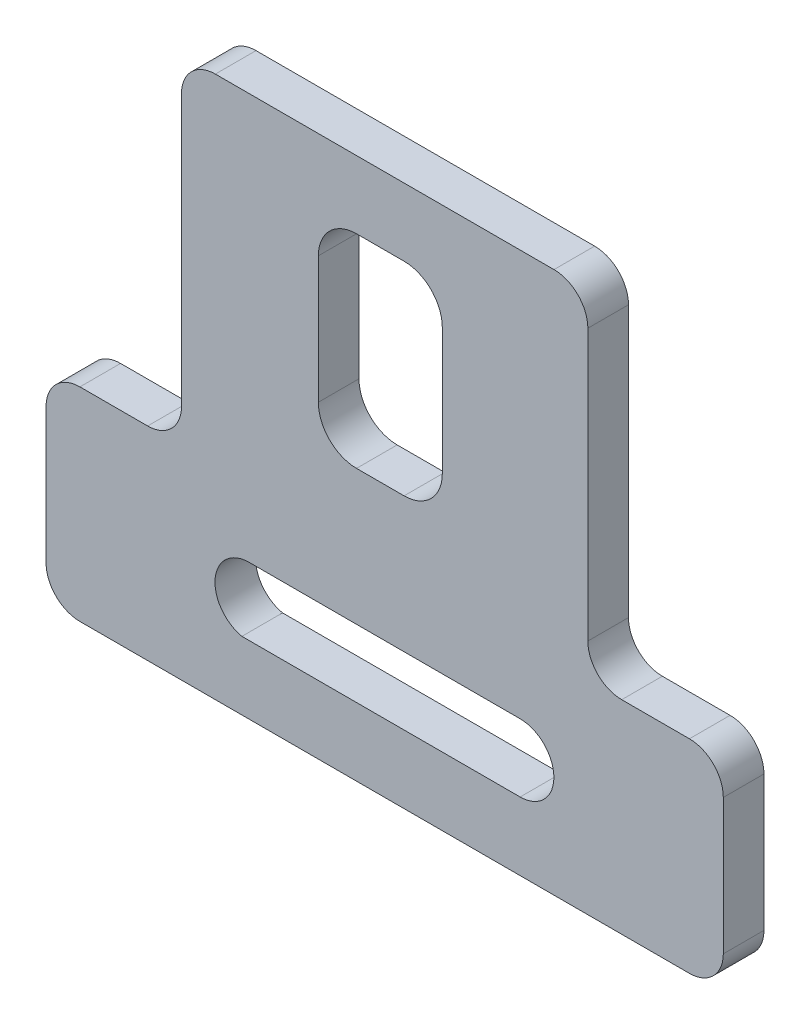
ISO-10303-21;
HEADER;
FILE_DESCRIPTION(('STEP AP214'),'2;1');
FILE_NAME('part.step','',(''),(''),'','','');
FILE_SCHEMA(('AUTOMOTIVE_DESIGN { 1 0 10303 214 1 1 1 1 }'));
ENDSEC;
DATA;
#1=APPLICATION_CONTEXT('core data for automotive mechanical design processes');
#2=APPLICATION_PROTOCOL_DEFINITION('international standard','automotive_design',2000,#1);
#3=PRODUCT_CONTEXT('',#1,'mechanical');
#4=PRODUCT('Part','Part','',(#3));
#5=PRODUCT_RELATED_PRODUCT_CATEGORY('part','',(#4));
#6=PRODUCT_DEFINITION_FORMATION('','',#4);
#7=PRODUCT_DEFINITION_CONTEXT('part definition',#1,'design');
#8=PRODUCT_DEFINITION('design','',#6,#7);
#9=PRODUCT_DEFINITION_SHAPE('','',#8);
#10=(LENGTH_UNIT() NAMED_UNIT(*) SI_UNIT(.MILLI.,.METRE.));
#11=(NAMED_UNIT(*) PLANE_ANGLE_UNIT() SI_UNIT($,.RADIAN.));
#12=(NAMED_UNIT(*) SI_UNIT($,.STERADIAN.) SOLID_ANGLE_UNIT());
#13=UNCERTAINTY_MEASURE_WITH_UNIT(LENGTH_MEASURE(1.E-05),#10,'distance_accuracy_value','');
#14=(GEOMETRIC_REPRESENTATION_CONTEXT(3) GLOBAL_UNCERTAINTY_ASSIGNED_CONTEXT((#13)) GLOBAL_UNIT_ASSIGNED_CONTEXT((#10,
#11,#12)) REPRESENTATION_CONTEXT('',''));
#15=CARTESIAN_POINT('',(0.,0.,0.));
#16=DIRECTION('',(0.,0.,1.));
#17=DIRECTION('',(1.,0.,0.));
#18=AXIS2_PLACEMENT_3D('',#15,#16,#17);
#19=CARTESIAN_POINT('',(-125.,100.,30.));
#20=DIRECTION('',(0.,0.,1.));
#21=DIRECTION('',(1.,0.,0.));
#22=AXIS2_PLACEMENT_3D('',#19,#20,#21);
#23=PLANE('',#22);
#24=CARTESIAN_POINT('',(-125.,100.,30.));
#25=DIRECTION('',(0.,0.,1.));
#26=DIRECTION('',(1.,0.,0.));
#27=AXIS2_PLACEMENT_3D('',#24,#25,#26);
#28=CIRCLE('',#27,25.);
#29=CARTESIAN_POINT('',(-125.,125.,30.));
#30=VERTEX_POINT('',#29);
#31=CARTESIAN_POINT('',(-150.,99.9999999999999,30.));
#32=VERTEX_POINT('',#31);
#33=EDGE_CURVE('E313',#30,#32,#28,.T.);
#34=ORIENTED_EDGE('',*,*,#33,.T.);
#35=DIRECTION('',(0.,-1.,0.));
#36=VECTOR('',#35,1.);
#37=CARTESIAN_POINT('',(-150.,-99.9999999999999,30.));
#38=LINE('',#37,#36);
#39=CARTESIAN_POINT('',(-150.,-99.9999999999999,30.));
#40=VERTEX_POINT('',#39);
#41=EDGE_CURVE('E316',#32,#40,#38,.T.);
#42=ORIENTED_EDGE('',*,*,#41,.T.);
#43=CARTESIAN_POINT('',(-175.,-100.,30.));
#44=DIRECTION('',(0.,0.,-1.));
#45=DIRECTION('',(-1.,0.,0.));
#46=AXIS2_PLACEMENT_3D('',#43,#44,#45);
#47=CIRCLE('',#46,25.);
#48=CARTESIAN_POINT('',(-175.,-125.,30.));
#49=VERTEX_POINT('',#48);
#50=EDGE_CURVE('E319',#40,#49,#47,.T.);
#51=ORIENTED_EDGE('',*,*,#50,.T.);
#52=DIRECTION('',(-1.,0.,0.));
#53=VECTOR('',#52,1.);
#54=CARTESIAN_POINT('',(-175.,-125.,30.));
#55=LINE('',#54,#53);
#56=CARTESIAN_POINT('',(-225.,-125.,30.));
#57=VERTEX_POINT('',#56);
#58=EDGE_CURVE('E321',#49,#57,#55,.T.);
#59=ORIENTED_EDGE('',*,*,#58,.T.);
#60=CARTESIAN_POINT('',(-225.,-150.,30.));
#61=DIRECTION('',(0.,0.,1.));
#62=DIRECTION('',(-1.,0.,0.));
#63=AXIS2_PLACEMENT_3D('',#60,#61,#62);
#64=CIRCLE('',#63,25.);
#65=CARTESIAN_POINT('',(-250.,-150.,30.));
#66=VERTEX_POINT('',#65);
#67=EDGE_CURVE('E323',#57,#66,#64,.T.);
#68=ORIENTED_EDGE('',*,*,#67,.T.);
#69=DIRECTION('',(0.,-1.,0.));
#70=VECTOR('',#69,1.);
#71=CARTESIAN_POINT('',(-250.,-250.,30.));
#72=LINE('',#71,#70);
#73=CARTESIAN_POINT('',(-250.,-250.,30.));
#74=VERTEX_POINT('',#73);
#75=EDGE_CURVE('E325',#66,#74,#72,.T.);
#76=ORIENTED_EDGE('',*,*,#75,.T.);
#77=CARTESIAN_POINT('',(-225.,-250.,30.));
#78=DIRECTION('',(0.,0.,1.));
#79=DIRECTION('',(-1.,0.,0.));
#80=AXIS2_PLACEMENT_3D('',#77,#78,#79);
#81=CIRCLE('',#80,25.);
#82=CARTESIAN_POINT('',(-225.,-275.,30.));
#83=VERTEX_POINT('',#82);
#84=EDGE_CURVE('E327',#74,#83,#81,.T.);
#85=ORIENTED_EDGE('',*,*,#84,.T.);
#86=DIRECTION('',(1.,0.,0.));
#87=VECTOR('',#86,1.);
#88=CARTESIAN_POINT('',(225.,-275.,30.));
#89=LINE('',#88,#87);
#90=CARTESIAN_POINT('',(225.,-275.,30.));
#91=VERTEX_POINT('',#90);
#92=EDGE_CURVE('E329',#83,#91,#89,.T.);
#93=ORIENTED_EDGE('',*,*,#92,.T.);
#94=CARTESIAN_POINT('',(225.,-250.,30.));
#95=DIRECTION('',(0.,0.,1.));
#96=DIRECTION('',(1.,0.,0.));
#97=AXIS2_PLACEMENT_3D('',#94,#95,#96);
#98=CIRCLE('',#97,25.);
#99=CARTESIAN_POINT('',(250.,-250.,30.));
#100=VERTEX_POINT('',#99);
#101=EDGE_CURVE('E331',#91,#100,#98,.T.);
#102=ORIENTED_EDGE('',*,*,#101,.T.);
#103=DIRECTION('',(0.,1.,0.));
#104=VECTOR('',#103,1.);
#105=CARTESIAN_POINT('',(250.,-250.,30.));
#106=LINE('',#105,#104);
#107=CARTESIAN_POINT('',(250.,-150.,30.));
#108=VERTEX_POINT('',#107);
#109=EDGE_CURVE('E333',#100,#108,#106,.T.);
#110=ORIENTED_EDGE('',*,*,#109,.T.);
#111=CARTESIAN_POINT('',(225.,-150.,30.));
#112=DIRECTION('',(0.,0.,1.));
#113=DIRECTION('',(1.,0.,0.));
#114=AXIS2_PLACEMENT_3D('',#111,#112,#113);
#115=CIRCLE('',#114,25.);
#116=CARTESIAN_POINT('',(225.,-125.,30.));
#117=VERTEX_POINT('',#116);
#118=EDGE_CURVE('E335',#108,#117,#115,.T.);
#119=ORIENTED_EDGE('',*,*,#118,.T.);
#120=DIRECTION('',(-1.,0.,0.));
#121=VECTOR('',#120,1.);
#122=CARTESIAN_POINT('',(225.,-125.,30.));
#123=LINE('',#122,#121);
#124=CARTESIAN_POINT('',(175.,-125.,30.));
#125=VERTEX_POINT('',#124);
#126=EDGE_CURVE('E337',#117,#125,#123,.T.);
#127=ORIENTED_EDGE('',*,*,#126,.T.);
#128=CARTESIAN_POINT('',(175.,-100.,30.));
#129=DIRECTION('',(0.,0.,-1.));
#130=DIRECTION('',(1.,0.,0.));
#131=AXIS2_PLACEMENT_3D('',#128,#129,#130);
#132=CIRCLE('',#131,25.);
#133=CARTESIAN_POINT('',(150.,-99.9999999999998,30.));
#134=VERTEX_POINT('',#133);
#135=EDGE_CURVE('E339',#125,#134,#132,.T.);
#136=ORIENTED_EDGE('',*,*,#135,.T.);
#137=DIRECTION('',(0.,1.,0.));
#138=VECTOR('',#137,1.);
#139=CARTESIAN_POINT('',(150.,-99.9999999999998,30.));
#140=LINE('',#139,#138);
#141=CARTESIAN_POINT('',(150.,99.9999999999999,30.));
#142=VERTEX_POINT('',#141);
#143=EDGE_CURVE('E341',#134,#142,#140,.T.);
#144=ORIENTED_EDGE('',*,*,#143,.T.);
#145=CARTESIAN_POINT('',(125.,100.,30.));
#146=DIRECTION('',(0.,0.,1.));
#147=DIRECTION('',(1.,0.,0.));
#148=AXIS2_PLACEMENT_3D('',#145,#146,#147);
#149=CIRCLE('',#148,25.);
#150=CARTESIAN_POINT('',(125.,125.,30.));
#151=VERTEX_POINT('',#150);
#152=EDGE_CURVE('E343',#142,#151,#149,.T.);
#153=ORIENTED_EDGE('',*,*,#152,.T.);
#154=DIRECTION('',(-1.,0.,0.));
#155=VECTOR('',#154,1.);
#156=CARTESIAN_POINT('',(-125.,125.,30.));
#157=LINE('',#156,#155);
#158=EDGE_CURVE('E345',#151,#30,#157,.T.);
#159=ORIENTED_EDGE('',*,*,#158,.T.);
#160=EDGE_LOOP('',(#34,#42,#51,#59,#68,#76,#85,#93,#102,#110,#119,#127,#136,#144,#153,#159));
#161=FACE_BOUND('',#160,.T.);
#162=DIRECTION('',(0.,1.,0.));
#163=VECTOR('',#162,1.);
#164=CARTESIAN_POINT('',(42.5251900393713,46.810893582636,30.));
#165=LINE('',#164,#163);
#166=CARTESIAN_POINT('',(42.5251900393713,-46.8108935826358,30.));
#167=VERTEX_POINT('',#166);
#168=CARTESIAN_POINT('',(42.5251900393713,46.810893582636,30.));
#169=VERTEX_POINT('',#168);
#170=EDGE_CURVE('E256',#167,#169,#165,.T.);
#171=ORIENTED_EDGE('',*,*,#170,.F.);
#172=CARTESIAN_POINT('',(14.3360836220072,-46.8108935826358,30.));
#173=DIRECTION('',(0.,0.,1.));
#174=DIRECTION('',(1.,0.,0.));
#175=AXIS2_PLACEMENT_3D('',#172,#173,#174);
#176=CIRCLE('',#175,28.1891064173641);
#177=CARTESIAN_POINT('',(14.3360836220072,-74.9999999999999,30.));
#178=VERTEX_POINT('',#177);
#179=EDGE_CURVE('E254',#178,#167,#176,.T.);
#180=ORIENTED_EDGE('',*,*,#179,.F.);
#181=DIRECTION('',(1.,0.,0.));
#182=VECTOR('',#181,1.);
#183=CARTESIAN_POINT('',(-20.7858946691993,-74.9999999999999,30.));
#184=LINE('',#183,#182);
#185=CARTESIAN_POINT('',(-20.7858946691993,-74.9999999999999,30.));
#186=VERTEX_POINT('',#185);
#187=EDGE_CURVE('E270',#186,#178,#184,.T.);
#188=ORIENTED_EDGE('',*,*,#187,.F.);
#189=CARTESIAN_POINT('',(-20.7858946691993,-46.8108935826358,30.));
#190=DIRECTION('',(0.,0.,1.));
#191=DIRECTION('',(-1.,0.,0.));
#192=AXIS2_PLACEMENT_3D('',#189,#190,#191);
#193=CIRCLE('',#192,28.1891064173641);
#194=CARTESIAN_POINT('',(-48.9750010865634,-46.8108935826358,30.));
#195=VERTEX_POINT('',#194);
#196=EDGE_CURVE('E267',#195,#186,#193,.T.);
#197=ORIENTED_EDGE('',*,*,#196,.F.);
#198=DIRECTION('',(0.,-1.,0.));
#199=VECTOR('',#198,1.);
#200=CARTESIAN_POINT('',(-48.9750010865634,46.810893582636,30.));
#201=LINE('',#200,#199);
#202=CARTESIAN_POINT('',(-48.9750010865634,46.810893582636,30.));
#203=VERTEX_POINT('',#202);
#204=EDGE_CURVE('E265',#203,#195,#201,.T.);
#205=ORIENTED_EDGE('',*,*,#204,.F.);
#206=CARTESIAN_POINT('',(-20.7858946691993,46.810893582636,30.));
#207=DIRECTION('',(0.,0.,1.));
#208=DIRECTION('',(-1.,0.,0.));
#209=AXIS2_PLACEMENT_3D('',#206,#207,#208);
#210=CIRCLE('',#209,28.1891064173641);
#211=CARTESIAN_POINT('',(-20.7858946691993,75.0000000000001,30.));
#212=VERTEX_POINT('',#211);
#213=EDGE_CURVE('E263',#212,#203,#210,.T.);
#214=ORIENTED_EDGE('',*,*,#213,.F.);
#215=DIRECTION('',(-1.,0.,0.));
#216=VECTOR('',#215,1.);
#217=CARTESIAN_POINT('',(-20.7858946691993,75.0000000000001,30.));
#218=LINE('',#217,#216);
#219=CARTESIAN_POINT('',(14.3360836220072,75.0000000000001,30.));
#220=VERTEX_POINT('',#219);
#221=EDGE_CURVE('E261',#220,#212,#218,.T.);
#222=ORIENTED_EDGE('',*,*,#221,.F.);
#223=CARTESIAN_POINT('',(14.3360836220072,46.810893582636,30.));
#224=DIRECTION('',(0.,0.,1.));
#225=DIRECTION('',(1.,0.,0.));
#226=AXIS2_PLACEMENT_3D('',#223,#224,#225);
#227=CIRCLE('',#226,28.1891064173641);
#228=EDGE_CURVE('E259',#169,#220,#227,.T.);
#229=ORIENTED_EDGE('',*,*,#228,.F.);
#230=EDGE_LOOP('',(#171,#180,#188,#197,#205,#214,#222,#229));
#231=FACE_BOUND('',#230,.T.);
#232=DIRECTION('',(1.,0.,0.));
#233=VECTOR('',#232,1.);
#234=CARTESIAN_POINT('',(-105.412874127919,-224.707142561818,30.));
#235=LINE('',#234,#233);
#236=CARTESIAN_POINT('',(-105.412874127919,-224.707142561818,30.));
#237=VERTEX_POINT('',#236);
#238=CARTESIAN_POINT('',(99.9990445185355,-224.707142561818,30.));
#239=VERTEX_POINT('',#238);
#240=EDGE_CURVE('E226',#237,#239,#235,.T.);
#241=ORIENTED_EDGE('',*,*,#240,.F.);
#242=CARTESIAN_POINT('',(-100.,-200.,30.));
#243=DIRECTION('',(0.,0.,1.));
#244=DIRECTION('',(1.,0.,0.));
#245=AXIS2_PLACEMENT_3D('',#242,#243,#244);
#246=CIRCLE('',#245,25.2931235693561);
#247=CARTESIAN_POINT('',(-100.16408543047,-174.707408676329,30.));
#248=VERTEX_POINT('',#247);
#249=EDGE_CURVE('E218',#248,#237,#246,.T.);
#250=ORIENTED_EDGE('',*,*,#249,.F.);
#251=DIRECTION('',(-1.,0.,0.));
#252=VECTOR('',#251,1.);
#253=CARTESIAN_POINT('',(-100.16408543047,-174.707408676329,30.));
#254=LINE('',#253,#252);
#255=CARTESIAN_POINT('',(99.8359145695304,-174.707408676329,30.));
#256=VERTEX_POINT('',#255);
#257=EDGE_CURVE('E240',#256,#248,#254,.T.);
#258=ORIENTED_EDGE('',*,*,#257,.F.);
#259=CARTESIAN_POINT('',(99.9174795440329,-199.707275619074,30.));
#260=DIRECTION('',(0.,0.,1.));
#261=DIRECTION('',(1.,0.,0.));
#262=AXIS2_PLACEMENT_3D('',#259,#260,#261);
#263=CIRCLE('',#262,25.);
#264=EDGE_CURVE('E238',#239,#256,#263,.T.);
#265=ORIENTED_EDGE('',*,*,#264,.F.);
#266=EDGE_LOOP('',(#241,#250,#258,#265));
#267=FACE_BOUND('',#266,.T.);
#268=ADVANCED_FACE('F33',(#161,#231,#267),#23,.T.);
#269=CARTESIAN_POINT('',(-125.,100.,0.));
#270=DIRECTION('',(0.,0.,1.));
#271=DIRECTION('',(1.,0.,0.));
#272=AXIS2_PLACEMENT_3D('',#269,#270,#271);
#273=PLANE('',#272);
#274=CARTESIAN_POINT('',(14.3360836220072,-46.8108935826358,0.));
#275=DIRECTION('',(0.,0.,1.));
#276=DIRECTION('',(1.,0.,0.));
#277=AXIS2_PLACEMENT_3D('',#274,#275,#276);
#278=CIRCLE('',#277,28.1891064173641);
#279=CARTESIAN_POINT('',(14.3360836220072,-74.9999999999999,0.));
#280=VERTEX_POINT('',#279);
#281=CARTESIAN_POINT('',(42.5251900393713,-46.8108935826358,0.));
#282=VERTEX_POINT('',#281);
#283=EDGE_CURVE('E234',#280,#282,#278,.T.);
#284=ORIENTED_EDGE('',*,*,#283,.T.);
#285=DIRECTION('',(0.,1.,0.));
#286=VECTOR('',#285,1.);
#287=CARTESIAN_POINT('',(42.5251900393713,46.810893582636,0.));
#288=LINE('',#287,#286);
#289=CARTESIAN_POINT('',(42.5251900393713,46.810893582636,0.));
#290=VERTEX_POINT('',#289);
#291=EDGE_CURVE('E275',#282,#290,#288,.T.);
#292=ORIENTED_EDGE('',*,*,#291,.T.);
#293=CARTESIAN_POINT('',(14.3360836220072,46.810893582636,0.));
#294=DIRECTION('',(0.,0.,1.));
#295=DIRECTION('',(1.,0.,0.));
#296=AXIS2_PLACEMENT_3D('',#293,#294,#295);
#297=CIRCLE('',#296,28.1891064173641);
#298=CARTESIAN_POINT('',(14.3360836220072,75.0000000000001,0.));
#299=VERTEX_POINT('',#298);
#300=EDGE_CURVE('E278',#290,#299,#297,.T.);
#301=ORIENTED_EDGE('',*,*,#300,.T.);
#302=DIRECTION('',(-1.,0.,0.));
#303=VECTOR('',#302,1.);
#304=CARTESIAN_POINT('',(-20.7858946691993,75.0000000000001,0.));
#305=LINE('',#304,#303);
#306=CARTESIAN_POINT('',(-20.7858946691993,75.0000000000001,0.));
#307=VERTEX_POINT('',#306);
#308=EDGE_CURVE('E281',#299,#307,#305,.T.);
#309=ORIENTED_EDGE('',*,*,#308,.T.);
#310=CARTESIAN_POINT('',(-20.7858946691993,46.810893582636,0.));
#311=DIRECTION('',(0.,0.,1.));
#312=DIRECTION('',(-1.,0.,0.));
#313=AXIS2_PLACEMENT_3D('',#310,#311,#312);
#314=CIRCLE('',#313,28.1891064173641);
#315=CARTESIAN_POINT('',(-48.9750010865634,46.810893582636,0.));
#316=VERTEX_POINT('',#315);
#317=EDGE_CURVE('E284',#307,#316,#314,.T.);
#318=ORIENTED_EDGE('',*,*,#317,.T.);
#319=DIRECTION('',(0.,-1.,0.));
#320=VECTOR('',#319,1.);
#321=CARTESIAN_POINT('',(-48.9750010865634,46.810893582636,0.));
#322=LINE('',#321,#320);
#323=CARTESIAN_POINT('',(-48.9750010865634,-46.8108935826358,0.));
#324=VERTEX_POINT('',#323);
#325=EDGE_CURVE('E287',#316,#324,#322,.T.);
#326=ORIENTED_EDGE('',*,*,#325,.T.);
#327=CARTESIAN_POINT('',(-20.7858946691993,-46.8108935826358,0.));
#328=DIRECTION('',(0.,0.,1.));
#329=DIRECTION('',(-1.,0.,0.));
#330=AXIS2_PLACEMENT_3D('',#327,#328,#329);
#331=CIRCLE('',#330,28.1891064173641);
#332=CARTESIAN_POINT('',(-20.7858946691993,-74.9999999999999,0.));
#333=VERTEX_POINT('',#332);
#334=EDGE_CURVE('E290',#324,#333,#331,.T.);
#335=ORIENTED_EDGE('',*,*,#334,.T.);
#336=DIRECTION('',(1.,0.,0.));
#337=VECTOR('',#336,1.);
#338=CARTESIAN_POINT('',(-20.7858946691993,-74.9999999999999,0.));
#339=LINE('',#338,#337);
#340=EDGE_CURVE('E257',#333,#280,#339,.T.);
#341=ORIENTED_EDGE('',*,*,#340,.T.);
#342=EDGE_LOOP('',(#284,#292,#301,#309,#318,#326,#335,#341));
#343=FACE_BOUND('',#342,.T.);
#344=CARTESIAN_POINT('',(-125.,100.,0.));
#345=DIRECTION('',(0.,0.,1.));
#346=DIRECTION('',(1.,0.,0.));
#347=AXIS2_PLACEMENT_3D('',#344,#345,#346);
#348=CIRCLE('',#347,25.);
#349=CARTESIAN_POINT('',(-125.,125.,0.));
#350=VERTEX_POINT('',#349);
#351=CARTESIAN_POINT('',(-150.,99.9999999999999,0.));
#352=VERTEX_POINT('',#351);
#353=EDGE_CURVE('E312',#350,#352,#348,.T.);
#354=ORIENTED_EDGE('',*,*,#353,.F.);
#355=DIRECTION('',(-1.,0.,0.));
#356=VECTOR('',#355,1.);
#357=CARTESIAN_POINT('',(-125.,125.,0.));
#358=LINE('',#357,#356);
#359=CARTESIAN_POINT('',(125.,125.,0.));
#360=VERTEX_POINT('',#359);
#361=EDGE_CURVE('E317',#360,#350,#358,.T.);
#362=ORIENTED_EDGE('',*,*,#361,.F.);
#363=CARTESIAN_POINT('',(125.,100.,0.));
#364=DIRECTION('',(0.,0.,1.));
#365=DIRECTION('',(1.,0.,0.));
#366=AXIS2_PLACEMENT_3D('',#363,#364,#365);
#367=CIRCLE('',#366,25.);
#368=CARTESIAN_POINT('',(150.,99.9999999999999,0.));
#369=VERTEX_POINT('',#368);
#370=EDGE_CURVE('E376',#369,#360,#367,.T.);
#371=ORIENTED_EDGE('',*,*,#370,.F.);
#372=DIRECTION('',(0.,1.,0.));
#373=VECTOR('',#372,1.);
#374=CARTESIAN_POINT('',(150.,-99.9999999999998,0.));
#375=LINE('',#374,#373);
#376=CARTESIAN_POINT('',(150.,-99.9999999999998,0.));
#377=VERTEX_POINT('',#376);
#378=EDGE_CURVE('E374',#377,#369,#375,.T.);
#379=ORIENTED_EDGE('',*,*,#378,.F.);
#380=CARTESIAN_POINT('',(175.,-100.,0.));
#381=DIRECTION('',(0.,0.,-1.));
#382=DIRECTION('',(1.,0.,0.));
#383=AXIS2_PLACEMENT_3D('',#380,#381,#382);
#384=CIRCLE('',#383,25.);
#385=CARTESIAN_POINT('',(175.,-125.,0.));
#386=VERTEX_POINT('',#385);
#387=EDGE_CURVE('E372',#386,#377,#384,.T.);
#388=ORIENTED_EDGE('',*,*,#387,.F.);
#389=DIRECTION('',(-1.,0.,0.));
#390=VECTOR('',#389,1.);
#391=CARTESIAN_POINT('',(225.,-125.,0.));
#392=LINE('',#391,#390);
#393=CARTESIAN_POINT('',(225.,-125.,0.));
#394=VERTEX_POINT('',#393);
#395=EDGE_CURVE('E370',#394,#386,#392,.T.);
#396=ORIENTED_EDGE('',*,*,#395,.F.);
#397=CARTESIAN_POINT('',(225.,-150.,0.));
#398=DIRECTION('',(0.,0.,1.));
#399=DIRECTION('',(1.,0.,0.));
#400=AXIS2_PLACEMENT_3D('',#397,#398,#399);
#401=CIRCLE('',#400,25.);
#402=CARTESIAN_POINT('',(250.,-150.,0.));
#403=VERTEX_POINT('',#402);
#404=EDGE_CURVE('E368',#403,#394,#401,.T.);
#405=ORIENTED_EDGE('',*,*,#404,.F.);
#406=DIRECTION('',(0.,1.,0.));
#407=VECTOR('',#406,1.);
#408=CARTESIAN_POINT('',(250.,-250.,0.));
#409=LINE('',#408,#407);
#410=CARTESIAN_POINT('',(250.,-250.,0.));
#411=VERTEX_POINT('',#410);
#412=EDGE_CURVE('E366',#411,#403,#409,.T.);
#413=ORIENTED_EDGE('',*,*,#412,.F.);
#414=CARTESIAN_POINT('',(225.,-250.,0.));
#415=DIRECTION('',(0.,0.,1.));
#416=DIRECTION('',(1.,0.,0.));
#417=AXIS2_PLACEMENT_3D('',#414,#415,#416);
#418=CIRCLE('',#417,25.);
#419=CARTESIAN_POINT('',(225.,-275.,0.));
#420=VERTEX_POINT('',#419);
#421=EDGE_CURVE('E364',#420,#411,#418,.T.);
#422=ORIENTED_EDGE('',*,*,#421,.F.);
#423=DIRECTION('',(1.,0.,0.));
#424=VECTOR('',#423,1.);
#425=CARTESIAN_POINT('',(225.,-275.,0.));
#426=LINE('',#425,#424);
#427=CARTESIAN_POINT('',(-225.,-275.,0.));
#428=VERTEX_POINT('',#427);
#429=EDGE_CURVE('E362',#428,#420,#426,.T.);
#430=ORIENTED_EDGE('',*,*,#429,.F.);
#431=CARTESIAN_POINT('',(-225.,-250.,0.));
#432=DIRECTION('',(0.,0.,1.));
#433=DIRECTION('',(-1.,0.,0.));
#434=AXIS2_PLACEMENT_3D('',#431,#432,#433);
#435=CIRCLE('',#434,25.);
#436=CARTESIAN_POINT('',(-250.,-250.,0.));
#437=VERTEX_POINT('',#436);
#438=EDGE_CURVE('E360',#437,#428,#435,.T.);
#439=ORIENTED_EDGE('',*,*,#438,.F.);
#440=DIRECTION('',(0.,-1.,0.));
#441=VECTOR('',#440,1.);
#442=CARTESIAN_POINT('',(-250.,-250.,0.));
#443=LINE('',#442,#441);
#444=CARTESIAN_POINT('',(-250.,-150.,0.));
#445=VERTEX_POINT('',#444);
#446=EDGE_CURVE('E358',#445,#437,#443,.T.);
#447=ORIENTED_EDGE('',*,*,#446,.F.);
#448=CARTESIAN_POINT('',(-225.,-150.,0.));
#449=DIRECTION('',(0.,0.,1.));
#450=DIRECTION('',(-1.,0.,0.));
#451=AXIS2_PLACEMENT_3D('',#448,#449,#450);
#452=CIRCLE('',#451,25.);
#453=CARTESIAN_POINT('',(-225.,-125.,0.));
#454=VERTEX_POINT('',#453);
#455=EDGE_CURVE('E356',#454,#445,#452,.T.);
#456=ORIENTED_EDGE('',*,*,#455,.F.);
#457=DIRECTION('',(-1.,0.,0.));
#458=VECTOR('',#457,1.);
#459=CARTESIAN_POINT('',(-175.,-125.,0.));
#460=LINE('',#459,#458);
#461=CARTESIAN_POINT('',(-175.,-125.,0.));
#462=VERTEX_POINT('',#461);
#463=EDGE_CURVE('E354',#462,#454,#460,.T.);
#464=ORIENTED_EDGE('',*,*,#463,.F.);
#465=CARTESIAN_POINT('',(-175.,-100.,0.));
#466=DIRECTION('',(0.,0.,-1.));
#467=DIRECTION('',(-1.,0.,0.));
#468=AXIS2_PLACEMENT_3D('',#465,#466,#467);
#469=CIRCLE('',#468,25.);
#470=CARTESIAN_POINT('',(-150.,-99.9999999999999,0.));
#471=VERTEX_POINT('',#470);
#472=EDGE_CURVE('E352',#471,#462,#469,.T.);
#473=ORIENTED_EDGE('',*,*,#472,.F.);
#474=DIRECTION('',(0.,-1.,0.));
#475=VECTOR('',#474,1.);
#476=CARTESIAN_POINT('',(-150.,-99.9999999999999,0.));
#477=LINE('',#476,#475);
#478=EDGE_CURVE('E350',#352,#471,#477,.T.);
#479=ORIENTED_EDGE('',*,*,#478,.F.);
#480=EDGE_LOOP('',(#354,#362,#371,#379,#388,#396,#405,#413,#422,#430,#439,#447,#456,#464,#473,#479));
#481=FACE_BOUND('',#480,.T.);
#482=CARTESIAN_POINT('',(-100.,-200.,0.));
#483=DIRECTION('',(0.,0.,1.));
#484=DIRECTION('',(1.,0.,0.));
#485=AXIS2_PLACEMENT_3D('',#482,#483,#484);
#486=CIRCLE('',#485,25.2931235693561);
#487=CARTESIAN_POINT('',(-100.16408543047,-174.707408676329,0.));
#488=VERTEX_POINT('',#487);
#489=CARTESIAN_POINT('',(-105.412874127919,-224.707142561818,0.));
#490=VERTEX_POINT('',#489);
#491=EDGE_CURVE('E56',#488,#490,#486,.T.);
#492=ORIENTED_EDGE('',*,*,#491,.T.);
#493=DIRECTION('',(1.,0.,0.));
#494=VECTOR('',#493,1.);
#495=CARTESIAN_POINT('',(-105.412874127919,-224.707142561818,0.));
#496=LINE('',#495,#494);
#497=CARTESIAN_POINT('',(99.9990445185355,-224.707142561818,0.));
#498=VERTEX_POINT('',#497);
#499=EDGE_CURVE('E233',#490,#498,#496,.T.);
#500=ORIENTED_EDGE('',*,*,#499,.T.);
#501=CARTESIAN_POINT('',(99.9174795440329,-199.707275619074,0.));
#502=DIRECTION('',(0.,0.,1.));
#503=DIRECTION('',(1.,0.,0.));
#504=AXIS2_PLACEMENT_3D('',#501,#502,#503);
#505=CIRCLE('',#504,25.);
#506=CARTESIAN_POINT('',(99.8359145695304,-174.707408676329,0.));
#507=VERTEX_POINT('',#506);
#508=EDGE_CURVE('E246',#498,#507,#505,.T.);
#509=ORIENTED_EDGE('',*,*,#508,.T.);
#510=DIRECTION('',(-1.,0.,0.));
#511=VECTOR('',#510,1.);
#512=CARTESIAN_POINT('',(-100.16408543047,-174.707408676329,0.));
#513=LINE('',#512,#511);
#514=EDGE_CURVE('E227',#507,#488,#513,.T.);
#515=ORIENTED_EDGE('',*,*,#514,.T.);
#516=EDGE_LOOP('',(#492,#500,#509,#515));
#517=FACE_BOUND('',#516,.T.);
#518=ADVANCED_FACE('F430',(#343,#481,#517),#273,.F.);
#519=CARTESIAN_POINT('',(-125.,100.,30.));
#520=DIRECTION('',(0.,0.,-1.));
#521=DIRECTION('',(-1.,0.,0.));
#522=AXIS2_PLACEMENT_3D('',#519,#520,#521);
#523=CYLINDRICAL_SURFACE('',#522,25.);
#524=ORIENTED_EDGE('',*,*,#353,.T.);
#525=DIRECTION('',(0.,0.,-1.));
#526=VECTOR('',#525,1.);
#527=CARTESIAN_POINT('',(-150.,99.9999999999999,30.));
#528=LINE('',#527,#526);
#529=EDGE_CURVE('E11',#32,#352,#528,.T.);
#530=ORIENTED_EDGE('',*,*,#529,.F.);
#531=ORIENTED_EDGE('',*,*,#33,.F.);
#532=DIRECTION('',(0.,0.,-1.));
#533=VECTOR('',#532,1.);
#534=CARTESIAN_POINT('',(-125.,125.,30.));
#535=LINE('',#534,#533);
#536=EDGE_CURVE('E347',#30,#350,#535,.T.);
#537=ORIENTED_EDGE('',*,*,#536,.T.);
#538=EDGE_LOOP('',(#524,#530,#531,#537));
#539=FACE_BOUND('',#538,.T.);
#540=ADVANCED_FACE('F35',(#539),#523,.T.);
#541=CARTESIAN_POINT('',(-150.,-99.9999999999999,30.));
#542=DIRECTION('',(1.,0.,0.));
#543=DIRECTION('',(0.,0.,-1.));
#544=AXIS2_PLACEMENT_3D('',#541,#542,#543);
#545=PLANE('',#544);
#546=ORIENTED_EDGE('',*,*,#478,.T.);
#547=DIRECTION('',(0.,0.,-1.));
#548=VECTOR('',#547,1.);
#549=CARTESIAN_POINT('',(-150.,-99.9999999999999,30.));
#550=LINE('',#549,#548);
#551=EDGE_CURVE('E41',#40,#471,#550,.T.);
#552=ORIENTED_EDGE('',*,*,#551,.F.);
#553=ORIENTED_EDGE('',*,*,#41,.F.);
#554=ORIENTED_EDGE('',*,*,#529,.T.);
#555=EDGE_LOOP('',(#546,#552,#553,#554));
#556=FACE_BOUND('',#555,.T.);
#557=ADVANCED_FACE('F448',(#556),#545,.F.);
#558=CARTESIAN_POINT('',(-175.,-100.,30.));
#559=DIRECTION('',(0.,0.,-1.));
#560=DIRECTION('',(-1.,0.,0.));
#561=AXIS2_PLACEMENT_3D('',#558,#559,#560);
#562=CYLINDRICAL_SURFACE('',#561,25.);
#563=ORIENTED_EDGE('',*,*,#472,.T.);
#564=DIRECTION('',(0.,0.,-1.));
#565=VECTOR('',#564,1.);
#566=CARTESIAN_POINT('',(-175.,-125.,30.));
#567=LINE('',#566,#565);
#568=EDGE_CURVE('E417',#49,#462,#567,.T.);
#569=ORIENTED_EDGE('',*,*,#568,.F.);
#570=ORIENTED_EDGE('',*,*,#50,.F.);
#571=ORIENTED_EDGE('',*,*,#551,.T.);
#572=EDGE_LOOP('',(#563,#569,#570,#571));
#573=FACE_BOUND('',#572,.T.);
#574=ADVANCED_FACE('F424',(#573),#562,.F.);
#575=CARTESIAN_POINT('',(-175.,-125.,30.));
#576=DIRECTION('',(0.,-1.,0.));
#577=DIRECTION('',(0.,0.,-1.));
#578=AXIS2_PLACEMENT_3D('',#575,#576,#577);
#579=PLANE('',#578);
#580=ORIENTED_EDGE('',*,*,#463,.T.);
#581=DIRECTION('',(0.,0.,-1.));
#582=VECTOR('',#581,1.);
#583=CARTESIAN_POINT('',(-225.,-125.,30.));
#584=LINE('',#583,#582);
#585=EDGE_CURVE('E414',#57,#454,#584,.T.);
#586=ORIENTED_EDGE('',*,*,#585,.F.);
#587=ORIENTED_EDGE('',*,*,#58,.F.);
#588=ORIENTED_EDGE('',*,*,#568,.T.);
#589=EDGE_LOOP('',(#580,#586,#587,#588));
#590=FACE_BOUND('',#589,.T.);
#591=ADVANCED_FACE('F436',(#590),#579,.F.);
#592=CARTESIAN_POINT('',(-225.,-150.,30.));
#593=DIRECTION('',(0.,0.,-1.));
#594=DIRECTION('',(-1.,0.,0.));
#595=AXIS2_PLACEMENT_3D('',#592,#593,#594);
#596=CYLINDRICAL_SURFACE('',#595,25.);
#597=ORIENTED_EDGE('',*,*,#455,.T.);
#598=DIRECTION('',(0.,0.,-1.));
#599=VECTOR('',#598,1.);
#600=CARTESIAN_POINT('',(-250.,-150.,30.));
#601=LINE('',#600,#599);
#602=EDGE_CURVE('E411',#66,#445,#601,.T.);
#603=ORIENTED_EDGE('',*,*,#602,.F.);
#604=ORIENTED_EDGE('',*,*,#67,.F.);
#605=ORIENTED_EDGE('',*,*,#585,.T.);
#606=EDGE_LOOP('',(#597,#603,#604,#605));
#607=FACE_BOUND('',#606,.T.);
#608=ADVANCED_FACE('F440',(#607),#596,.T.);
#609=CARTESIAN_POINT('',(-250.,-250.,30.));
#610=DIRECTION('',(1.,0.,0.));
#611=DIRECTION('',(0.,0.,-1.));
#612=AXIS2_PLACEMENT_3D('',#609,#610,#611);
#613=PLANE('',#612);
#614=ORIENTED_EDGE('',*,*,#446,.T.);
#615=DIRECTION('',(0.,0.,-1.));
#616=VECTOR('',#615,1.);
#617=CARTESIAN_POINT('',(-250.,-250.,30.));
#618=LINE('',#617,#616);
#619=EDGE_CURVE('E408',#74,#437,#618,.T.);
#620=ORIENTED_EDGE('',*,*,#619,.F.);
#621=ORIENTED_EDGE('',*,*,#75,.F.);
#622=ORIENTED_EDGE('',*,*,#602,.T.);
#623=EDGE_LOOP('',(#614,#620,#621,#622));
#624=FACE_BOUND('',#623,.T.);
#625=ADVANCED_FACE('F501',(#624),#613,.F.);
#626=CARTESIAN_POINT('',(-225.,-250.,30.));
#627=DIRECTION('',(0.,0.,-1.));
#628=DIRECTION('',(-1.,0.,0.));
#629=AXIS2_PLACEMENT_3D('',#626,#627,#628);
#630=CYLINDRICAL_SURFACE('',#629,25.);
#631=ORIENTED_EDGE('',*,*,#438,.T.);
#632=DIRECTION('',(0.,0.,-1.));
#633=VECTOR('',#632,1.);
#634=CARTESIAN_POINT('',(-225.,-275.,30.));
#635=LINE('',#634,#633);
#636=EDGE_CURVE('E405',#83,#428,#635,.T.);
#637=ORIENTED_EDGE('',*,*,#636,.F.);
#638=ORIENTED_EDGE('',*,*,#84,.F.);
#639=ORIENTED_EDGE('',*,*,#619,.T.);
#640=EDGE_LOOP('',(#631,#637,#638,#639));
#641=FACE_BOUND('',#640,.T.);
#642=ADVANCED_FACE('F498',(#641),#630,.T.);
#643=CARTESIAN_POINT('',(225.,-275.,30.));
#644=DIRECTION('',(0.,1.,0.));
#645=DIRECTION('',(-1.,0.,0.));
#646=AXIS2_PLACEMENT_3D('',#643,#644,#645);
#647=PLANE('',#646);
#648=ORIENTED_EDGE('',*,*,#429,.T.);
#649=DIRECTION('',(0.,0.,-1.));
#650=VECTOR('',#649,1.);
#651=CARTESIAN_POINT('',(225.,-275.,30.));
#652=LINE('',#651,#650);
#653=EDGE_CURVE('E402',#91,#420,#652,.T.);
#654=ORIENTED_EDGE('',*,*,#653,.F.);
#655=ORIENTED_EDGE('',*,*,#92,.F.);
#656=ORIENTED_EDGE('',*,*,#636,.T.);
#657=EDGE_LOOP('',(#648,#654,#655,#656));
#658=FACE_BOUND('',#657,.T.);
#659=ADVANCED_FACE('F494',(#658),#647,.F.);
#660=CARTESIAN_POINT('',(225.,-250.,30.));
#661=DIRECTION('',(0.,0.,-1.));
#662=DIRECTION('',(-1.,0.,0.));
#663=AXIS2_PLACEMENT_3D('',#660,#661,#662);
#664=CYLINDRICAL_SURFACE('',#663,25.);
#665=ORIENTED_EDGE('',*,*,#421,.T.);
#666=DIRECTION('',(0.,0.,-1.));
#667=VECTOR('',#666,1.);
#668=CARTESIAN_POINT('',(250.,-250.,30.));
#669=LINE('',#668,#667);
#670=EDGE_CURVE('E399',#100,#411,#669,.T.);
#671=ORIENTED_EDGE('',*,*,#670,.F.);
#672=ORIENTED_EDGE('',*,*,#101,.F.);
#673=ORIENTED_EDGE('',*,*,#653,.T.);
#674=EDGE_LOOP('',(#665,#671,#672,#673));
#675=FACE_BOUND('',#674,.T.);
#676=ADVANCED_FACE('F490',(#675),#664,.T.);
#677=CARTESIAN_POINT('',(250.,-250.,30.));
#678=DIRECTION('',(-1.,0.,0.));
#679=DIRECTION('',(0.,-1.,0.));
#680=AXIS2_PLACEMENT_3D('',#677,#678,#679);
#681=PLANE('',#680);
#682=ORIENTED_EDGE('',*,*,#412,.T.);
#683=DIRECTION('',(0.,0.,-1.));
#684=VECTOR('',#683,1.);
#685=CARTESIAN_POINT('',(250.,-150.,30.));
#686=LINE('',#685,#684);
#687=EDGE_CURVE('E396',#108,#403,#686,.T.);
#688=ORIENTED_EDGE('',*,*,#687,.F.);
#689=ORIENTED_EDGE('',*,*,#109,.F.);
#690=ORIENTED_EDGE('',*,*,#670,.T.);
#691=EDGE_LOOP('',(#682,#688,#689,#690));
#692=FACE_BOUND('',#691,.T.);
#693=ADVANCED_FACE('F485',(#692),#681,.F.);
#694=CARTESIAN_POINT('',(225.,-150.,30.));
#695=DIRECTION('',(0.,0.,-1.));
#696=DIRECTION('',(-1.,0.,0.));
#697=AXIS2_PLACEMENT_3D('',#694,#695,#696);
#698=CYLINDRICAL_SURFACE('',#697,25.);
#699=ORIENTED_EDGE('',*,*,#404,.T.);
#700=DIRECTION('',(0.,0.,-1.));
#701=VECTOR('',#700,1.);
#702=CARTESIAN_POINT('',(225.,-125.,30.));
#703=LINE('',#702,#701);
#704=EDGE_CURVE('E393',#117,#394,#703,.T.);
#705=ORIENTED_EDGE('',*,*,#704,.F.);
#706=ORIENTED_EDGE('',*,*,#118,.F.);
#707=ORIENTED_EDGE('',*,*,#687,.T.);
#708=EDGE_LOOP('',(#699,#705,#706,#707));
#709=FACE_BOUND('',#708,.T.);
#710=ADVANCED_FACE('F479',(#709),#698,.T.);
#711=CARTESIAN_POINT('',(225.,-125.,30.));
#712=DIRECTION('',(0.,-1.,0.));
#713=DIRECTION('',(1.,0.,0.));
#714=AXIS2_PLACEMENT_3D('',#711,#712,#713);
#715=PLANE('',#714);
#716=ORIENTED_EDGE('',*,*,#395,.T.);
#717=DIRECTION('',(0.,0.,-1.));
#718=VECTOR('',#717,1.);
#719=CARTESIAN_POINT('',(175.,-125.,30.));
#720=LINE('',#719,#718);
#721=EDGE_CURVE('E390',#125,#386,#720,.T.);
#722=ORIENTED_EDGE('',*,*,#721,.F.);
#723=ORIENTED_EDGE('',*,*,#126,.F.);
#724=ORIENTED_EDGE('',*,*,#704,.T.);
#725=EDGE_LOOP('',(#716,#722,#723,#724));
#726=FACE_BOUND('',#725,.T.);
#727=ADVANCED_FACE('F475',(#726),#715,.F.);
#728=CARTESIAN_POINT('',(175.,-100.,30.));
#729=DIRECTION('',(0.,0.,-1.));
#730=DIRECTION('',(-1.,0.,0.));
#731=AXIS2_PLACEMENT_3D('',#728,#729,#730);
#732=CYLINDRICAL_SURFACE('',#731,25.);
#733=ORIENTED_EDGE('',*,*,#387,.T.);
#734=DIRECTION('',(0.,0.,-1.));
#735=VECTOR('',#734,1.);
#736=CARTESIAN_POINT('',(150.,-99.9999999999998,30.));
#737=LINE('',#736,#735);
#738=EDGE_CURVE('E387',#134,#377,#737,.T.);
#739=ORIENTED_EDGE('',*,*,#738,.F.);
#740=ORIENTED_EDGE('',*,*,#135,.F.);
#741=ORIENTED_EDGE('',*,*,#721,.T.);
#742=EDGE_LOOP('',(#733,#739,#740,#741));
#743=FACE_BOUND('',#742,.T.);
#744=ADVANCED_FACE('F470',(#743),#732,.F.);
#745=CARTESIAN_POINT('',(150.,-99.9999999999998,30.));
#746=DIRECTION('',(-1.,0.,0.));
#747=DIRECTION('',(0.,-1.,0.));
#748=AXIS2_PLACEMENT_3D('',#745,#746,#747);
#749=PLANE('',#748);
#750=ORIENTED_EDGE('',*,*,#378,.T.);
#751=DIRECTION('',(0.,0.,-1.));
#752=VECTOR('',#751,1.);
#753=CARTESIAN_POINT('',(150.,99.9999999999999,30.));
#754=LINE('',#753,#752);
#755=EDGE_CURVE('E384',#142,#369,#754,.T.);
#756=ORIENTED_EDGE('',*,*,#755,.F.);
#757=ORIENTED_EDGE('',*,*,#143,.F.);
#758=ORIENTED_EDGE('',*,*,#738,.T.);
#759=EDGE_LOOP('',(#750,#756,#757,#758));
#760=FACE_BOUND('',#759,.T.);
#761=ADVANCED_FACE('F464',(#760),#749,.F.);
#762=CARTESIAN_POINT('',(125.,100.,30.));
#763=DIRECTION('',(0.,0.,-1.));
#764=DIRECTION('',(-1.,0.,0.));
#765=AXIS2_PLACEMENT_3D('',#762,#763,#764);
#766=CYLINDRICAL_SURFACE('',#765,25.);
#767=ORIENTED_EDGE('',*,*,#370,.T.);
#768=DIRECTION('',(0.,0.,-1.));
#769=VECTOR('',#768,1.);
#770=CARTESIAN_POINT('',(125.,125.,30.));
#771=LINE('',#770,#769);
#772=EDGE_CURVE('E381',#151,#360,#771,.T.);
#773=ORIENTED_EDGE('',*,*,#772,.F.);
#774=ORIENTED_EDGE('',*,*,#152,.F.);
#775=ORIENTED_EDGE('',*,*,#755,.T.);
#776=EDGE_LOOP('',(#767,#773,#774,#775));
#777=FACE_BOUND('',#776,.T.);
#778=ADVANCED_FACE('F460',(#777),#766,.T.);
#779=CARTESIAN_POINT('',(-125.,125.,30.));
#780=DIRECTION('',(0.,-1.,0.));
#781=DIRECTION('',(0.,0.,-1.));
#782=AXIS2_PLACEMENT_3D('',#779,#780,#781);
#783=PLANE('',#782);
#784=ORIENTED_EDGE('',*,*,#361,.T.);
#785=ORIENTED_EDGE('',*,*,#536,.F.);
#786=ORIENTED_EDGE('',*,*,#158,.F.);
#787=ORIENTED_EDGE('',*,*,#772,.T.);
#788=EDGE_LOOP('',(#784,#785,#786,#787));
#789=FACE_BOUND('',#788,.T.);
#790=ADVANCED_FACE('F455',(#789),#783,.F.);
#791=CARTESIAN_POINT('',(14.3360836220072,-46.8108935826358,30.));
#792=DIRECTION('',(0.,0.,-1.));
#793=DIRECTION('',(-1.,0.,0.));
#794=AXIS2_PLACEMENT_3D('',#791,#792,#793);
#795=CYLINDRICAL_SURFACE('',#794,28.1891064173641);
#796=ORIENTED_EDGE('',*,*,#283,.F.);
#797=DIRECTION('',(0.,0.,-1.));
#798=VECTOR('',#797,1.);
#799=CARTESIAN_POINT('',(14.3360836220072,-74.9999999999999,30.));
#800=LINE('',#799,#798);
#801=EDGE_CURVE('E272',#178,#280,#800,.T.);
#802=ORIENTED_EDGE('',*,*,#801,.F.);
#803=ORIENTED_EDGE('',*,*,#179,.T.);
#804=DIRECTION('',(0.,0.,-1.));
#805=VECTOR('',#804,1.);
#806=CARTESIAN_POINT('',(42.5251900393713,-46.8108935826358,30.));
#807=LINE('',#806,#805);
#808=EDGE_CURVE('E309',#167,#282,#807,.T.);
#809=ORIENTED_EDGE('',*,*,#808,.T.);
#810=EDGE_LOOP('',(#796,#802,#803,#809));
#811=FACE_BOUND('',#810,.T.);
#812=ADVANCED_FACE('F518',(#811),#795,.F.);
#813=CARTESIAN_POINT('',(42.5251900393713,46.810893582636,30.));
#814=DIRECTION('',(-1.,0.,0.));
#815=DIRECTION('',(0.,0.,1.));
#816=AXIS2_PLACEMENT_3D('',#813,#814,#815);
#817=PLANE('',#816);
#818=ORIENTED_EDGE('',*,*,#291,.F.);
#819=ORIENTED_EDGE('',*,*,#808,.F.);
#820=ORIENTED_EDGE('',*,*,#170,.T.);
#821=DIRECTION('',(0.,0.,-1.));
#822=VECTOR('',#821,1.);
#823=CARTESIAN_POINT('',(42.5251900393713,46.810893582636,30.));
#824=LINE('',#823,#822);
#825=EDGE_CURVE('E307',#169,#290,#824,.T.);
#826=ORIENTED_EDGE('',*,*,#825,.T.);
#827=EDGE_LOOP('',(#818,#819,#820,#826));
#828=FACE_BOUND('',#827,.T.);
#829=ADVANCED_FACE('F580',(#828),#817,.T.);
#830=CARTESIAN_POINT('',(14.3360836220072,46.810893582636,30.));
#831=DIRECTION('',(0.,0.,-1.));
#832=DIRECTION('',(-1.,0.,0.));
#833=AXIS2_PLACEMENT_3D('',#830,#831,#832);
#834=CYLINDRICAL_SURFACE('',#833,28.1891064173641);
#835=ORIENTED_EDGE('',*,*,#300,.F.);
#836=ORIENTED_EDGE('',*,*,#825,.F.);
#837=ORIENTED_EDGE('',*,*,#228,.T.);
#838=DIRECTION('',(0.,0.,-1.));
#839=VECTOR('',#838,1.);
#840=CARTESIAN_POINT('',(14.3360836220072,75.0000000000001,30.));
#841=LINE('',#840,#839);
#842=EDGE_CURVE('E305',#220,#299,#841,.T.);
#843=ORIENTED_EDGE('',*,*,#842,.T.);
#844=EDGE_LOOP('',(#835,#836,#837,#843));
#845=FACE_BOUND('',#844,.T.);
#846=ADVANCED_FACE('F587',(#845),#834,.F.);
#847=CARTESIAN_POINT('',(-20.7858946691993,75.0000000000001,30.));
#848=DIRECTION('',(0.,-1.,0.));
#849=DIRECTION('',(0.,0.,-1.));
#850=AXIS2_PLACEMENT_3D('',#847,#848,#849);
#851=PLANE('',#850);
#852=ORIENTED_EDGE('',*,*,#308,.F.);
#853=ORIENTED_EDGE('',*,*,#842,.F.);
#854=ORIENTED_EDGE('',*,*,#221,.T.);
#855=DIRECTION('',(0.,0.,-1.));
#856=VECTOR('',#855,1.);
#857=CARTESIAN_POINT('',(-20.7858946691993,75.0000000000001,30.));
#858=LINE('',#857,#856);
#859=EDGE_CURVE('E303',#212,#307,#858,.T.);
#860=ORIENTED_EDGE('',*,*,#859,.T.);
#861=EDGE_LOOP('',(#852,#853,#854,#860));
#862=FACE_BOUND('',#861,.T.);
#863=ADVANCED_FACE('F594',(#862),#851,.T.);
#864=CARTESIAN_POINT('',(-20.7858946691993,46.810893582636,30.));
#865=DIRECTION('',(0.,0.,-1.));
#866=DIRECTION('',(-1.,0.,0.));
#867=AXIS2_PLACEMENT_3D('',#864,#865,#866);
#868=CYLINDRICAL_SURFACE('',#867,28.1891064173641);
#869=ORIENTED_EDGE('',*,*,#317,.F.);
#870=ORIENTED_EDGE('',*,*,#859,.F.);
#871=ORIENTED_EDGE('',*,*,#213,.T.);
#872=DIRECTION('',(0.,0.,-1.));
#873=VECTOR('',#872,1.);
#874=CARTESIAN_POINT('',(-48.9750010865634,46.810893582636,30.));
#875=LINE('',#874,#873);
#876=EDGE_CURVE('E301',#203,#316,#875,.T.);
#877=ORIENTED_EDGE('',*,*,#876,.T.);
#878=EDGE_LOOP('',(#869,#870,#871,#877));
#879=FACE_BOUND('',#878,.T.);
#880=ADVANCED_FACE('F602',(#879),#868,.F.);
#881=CARTESIAN_POINT('',(-48.9750010865634,46.810893582636,30.));
#882=DIRECTION('',(1.,0.,0.));
#883=DIRECTION('',(0.,1.,0.));
#884=AXIS2_PLACEMENT_3D('',#881,#882,#883);
#885=PLANE('',#884);
#886=ORIENTED_EDGE('',*,*,#325,.F.);
#887=ORIENTED_EDGE('',*,*,#876,.F.);
#888=ORIENTED_EDGE('',*,*,#204,.T.);
#889=DIRECTION('',(0.,0.,-1.));
#890=VECTOR('',#889,1.);
#891=CARTESIAN_POINT('',(-48.9750010865634,-46.8108935826358,30.));
#892=LINE('',#891,#890);
#893=EDGE_CURVE('E299',#195,#324,#892,.T.);
#894=ORIENTED_EDGE('',*,*,#893,.T.);
#895=EDGE_LOOP('',(#886,#887,#888,#894));
#896=FACE_BOUND('',#895,.T.);
#897=ADVANCED_FACE('F610',(#896),#885,.T.);
#898=CARTESIAN_POINT('',(-20.7858946691993,-46.8108935826358,30.));
#899=DIRECTION('',(0.,0.,-1.));
#900=DIRECTION('',(-1.,0.,0.));
#901=AXIS2_PLACEMENT_3D('',#898,#899,#900);
#902=CYLINDRICAL_SURFACE('',#901,28.1891064173641);
#903=ORIENTED_EDGE('',*,*,#334,.F.);
#904=ORIENTED_EDGE('',*,*,#893,.F.);
#905=ORIENTED_EDGE('',*,*,#196,.T.);
#906=DIRECTION('',(0.,0.,-1.));
#907=VECTOR('',#906,1.);
#908=CARTESIAN_POINT('',(-20.7858946691993,-74.9999999999999,30.));
#909=LINE('',#908,#907);
#910=EDGE_CURVE('E297',#186,#333,#909,.T.);
#911=ORIENTED_EDGE('',*,*,#910,.T.);
#912=EDGE_LOOP('',(#903,#904,#905,#911));
#913=FACE_BOUND('',#912,.T.);
#914=ADVANCED_FACE('F618',(#913),#902,.F.);
#915=CARTESIAN_POINT('',(-20.7858946691993,-74.9999999999999,30.));
#916=DIRECTION('',(0.,1.,0.));
#917=DIRECTION('',(0.,0.,1.));
#918=AXIS2_PLACEMENT_3D('',#915,#916,#917);
#919=PLANE('',#918);
#920=ORIENTED_EDGE('',*,*,#340,.F.);
#921=ORIENTED_EDGE('',*,*,#910,.F.);
#922=ORIENTED_EDGE('',*,*,#187,.T.);
#923=ORIENTED_EDGE('',*,*,#801,.T.);
#924=EDGE_LOOP('',(#920,#921,#922,#923));
#925=FACE_BOUND('',#924,.T.);
#926=ADVANCED_FACE('F626',(#925),#919,.T.);
#927=CARTESIAN_POINT('',(-100.,-200.,30.));
#928=DIRECTION('',(0.,0.,-1.));
#929=DIRECTION('',(-1.,0.,0.));
#930=AXIS2_PLACEMENT_3D('',#927,#928,#929);
#931=CYLINDRICAL_SURFACE('',#930,25.2931235693561);
#932=ORIENTED_EDGE('',*,*,#491,.F.);
#933=DIRECTION('',(0.,0.,-1.));
#934=VECTOR('',#933,1.);
#935=CARTESIAN_POINT('',(-100.16408543047,-174.707408676329,30.));
#936=LINE('',#935,#934);
#937=EDGE_CURVE('E222',#248,#488,#936,.T.);
#938=ORIENTED_EDGE('',*,*,#937,.F.);
#939=ORIENTED_EDGE('',*,*,#249,.T.);
#940=DIRECTION('',(0.,0.,-1.));
#941=VECTOR('',#940,1.);
#942=CARTESIAN_POINT('',(-105.412874127919,-224.707142561818,30.));
#943=LINE('',#942,#941);
#944=EDGE_CURVE('E221',#237,#490,#943,.T.);
#945=ORIENTED_EDGE('',*,*,#944,.T.);
#946=EDGE_LOOP('',(#932,#938,#939,#945));
#947=FACE_BOUND('',#946,.T.);
#948=ADVANCED_FACE('F220',(#947),#931,.F.);
#949=CARTESIAN_POINT('',(-105.412874127919,-224.707142561818,30.));
#950=DIRECTION('',(0.,1.,0.));
#951=DIRECTION('',(0.,0.,1.));
#952=AXIS2_PLACEMENT_3D('',#949,#950,#951);
#953=PLANE('',#952);
#954=ORIENTED_EDGE('',*,*,#499,.F.);
#955=ORIENTED_EDGE('',*,*,#944,.F.);
#956=ORIENTED_EDGE('',*,*,#240,.T.);
#957=DIRECTION('',(0.,0.,-1.));
#958=VECTOR('',#957,1.);
#959=CARTESIAN_POINT('',(99.9990445185355,-224.707142561818,30.));
#960=LINE('',#959,#958);
#961=EDGE_CURVE('E235',#239,#498,#960,.T.);
#962=ORIENTED_EDGE('',*,*,#961,.T.);
#963=EDGE_LOOP('',(#954,#955,#956,#962));
#964=FACE_BOUND('',#963,.T.);
#965=ADVANCED_FACE('F230',(#964),#953,.T.);
#966=CARTESIAN_POINT('',(99.9174795440329,-199.707275619074,30.));
#967=DIRECTION('',(0.,0.,-1.));
#968=DIRECTION('',(-1.,0.,0.));
#969=AXIS2_PLACEMENT_3D('',#966,#967,#968);
#970=CYLINDRICAL_SURFACE('',#969,25.);
#971=ORIENTED_EDGE('',*,*,#508,.F.);
#972=ORIENTED_EDGE('',*,*,#961,.F.);
#973=ORIENTED_EDGE('',*,*,#264,.T.);
#974=DIRECTION('',(0.,0.,-1.));
#975=VECTOR('',#974,1.);
#976=CARTESIAN_POINT('',(99.8359145695304,-174.707408676329,30.));
#977=LINE('',#976,#975);
#978=EDGE_CURVE('E48',#256,#507,#977,.T.);
#979=ORIENTED_EDGE('',*,*,#978,.T.);
#980=EDGE_LOOP('',(#971,#972,#973,#979));
#981=FACE_BOUND('',#980,.T.);
#982=ADVANCED_FACE('F647',(#981),#970,.F.);
#983=CARTESIAN_POINT('',(-100.16408543047,-174.707408676329,30.));
#984=DIRECTION('',(0.,-1.,0.));
#985=DIRECTION('',(1.,0.,0.));
#986=AXIS2_PLACEMENT_3D('',#983,#984,#985);
#987=PLANE('',#986);
#988=ORIENTED_EDGE('',*,*,#514,.F.);
#989=ORIENTED_EDGE('',*,*,#978,.F.);
#990=ORIENTED_EDGE('',*,*,#257,.T.);
#991=ORIENTED_EDGE('',*,*,#937,.T.);
#992=EDGE_LOOP('',(#988,#989,#990,#991));
#993=FACE_BOUND('',#992,.T.);
#994=ADVANCED_FACE('F654',(#993),#987,.T.);
#995=CLOSED_SHELL('',(#268,#518,#540,#557,#574,#591,#608,#625,#642,#659,#676,#693,#710,#727,
#744,#761,#778,#790,#812,#829,#846,#863,#880,#897,#914,#926,#948,#965,#982,#994));
#996=MANIFOLD_SOLID_BREP('B2',#995);
#997=ADVANCED_BREP_SHAPE_REPRESENTATION('',(#18,#996),#14);
#998=SHAPE_DEFINITION_REPRESENTATION(#9,#997);
ENDSEC;
END-ISO-10303-21;
